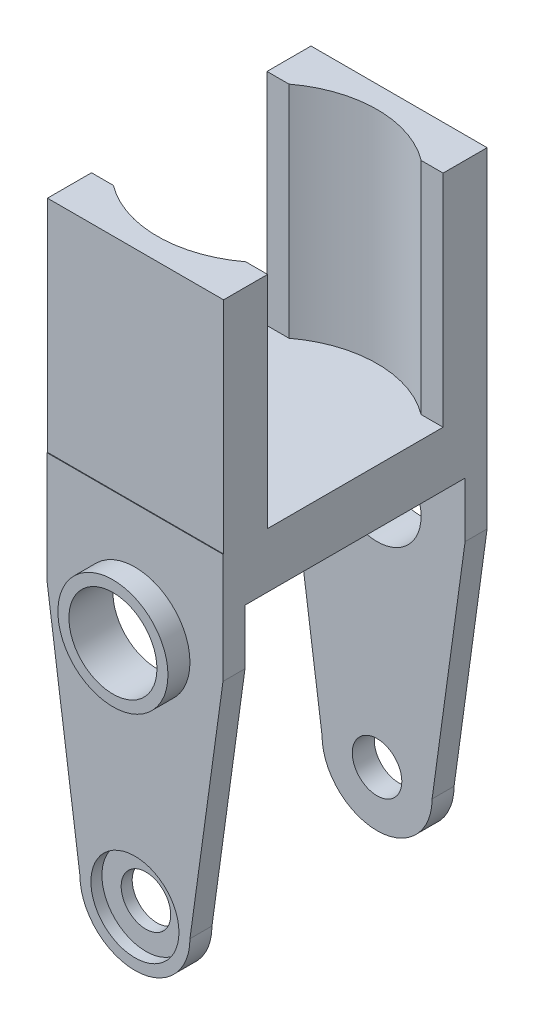
ISO-10303-21;
HEADER;
FILE_DESCRIPTION(('STEP AP214'),'2;1');
FILE_NAME('part.step','',(''),(''),'','','');
FILE_SCHEMA(('AUTOMOTIVE_DESIGN { 1 0 10303 214 1 1 1 1 }'));
ENDSEC;
DATA;
#1=APPLICATION_CONTEXT('core data for automotive mechanical design processes');
#2=APPLICATION_PROTOCOL_DEFINITION('international standard','automotive_design',2000,#1);
#3=PRODUCT_CONTEXT('',#1,'mechanical');
#4=PRODUCT('Part','Part','',(#3));
#5=PRODUCT_RELATED_PRODUCT_CATEGORY('part','',(#4));
#6=PRODUCT_DEFINITION_FORMATION('','',#4);
#7=PRODUCT_DEFINITION_CONTEXT('part definition',#1,'design');
#8=PRODUCT_DEFINITION('design','',#6,#7);
#9=PRODUCT_DEFINITION_SHAPE('','',#8);
#10=(LENGTH_UNIT() NAMED_UNIT(*) SI_UNIT(.MILLI.,.METRE.));
#11=(NAMED_UNIT(*) PLANE_ANGLE_UNIT() SI_UNIT($,.RADIAN.));
#12=(NAMED_UNIT(*) SI_UNIT($,.STERADIAN.) SOLID_ANGLE_UNIT());
#13=UNCERTAINTY_MEASURE_WITH_UNIT(LENGTH_MEASURE(1.E-05),#10,'distance_accuracy_value','');
#14=(GEOMETRIC_REPRESENTATION_CONTEXT(3) GLOBAL_UNCERTAINTY_ASSIGNED_CONTEXT((#13)) GLOBAL_UNIT_ASSIGNED_CONTEXT((#10,
#11,#12)) REPRESENTATION_CONTEXT('',''));
#15=CARTESIAN_POINT('',(0.,0.,0.));
#16=DIRECTION('',(0.,0.,1.));
#17=DIRECTION('',(1.,0.,0.));
#18=AXIS2_PLACEMENT_3D('',#15,#16,#17);
#19=CARTESIAN_POINT('',(-8.,10.,24.));
#20=DIRECTION('',(1.,0.,0.));
#21=DIRECTION('',(0.,0.,-1.));
#22=AXIS2_PLACEMENT_3D('',#19,#20,#21);
#23=PLANE('',#22);
#24=DIRECTION('',(0.,1.,0.));
#25=VECTOR('',#24,1.);
#26=CARTESIAN_POINT('',(-8.,0.,2.));
#27=LINE('',#26,#25);
#28=CARTESIAN_POINT('',(-8.,0.,2.));
#29=VERTEX_POINT('',#28);
#30=CARTESIAN_POINT('',(-8.,5.,2.));
#31=VERTEX_POINT('',#30);
#32=EDGE_CURVE('E203',#29,#31,#27,.T.);
#33=ORIENTED_EDGE('',*,*,#32,.T.);
#34=DIRECTION('',(0.,0.,1.));
#35=VECTOR('',#34,1.);
#36=CARTESIAN_POINT('',(-8.,5.,0.));
#37=LINE('',#36,#35);
#38=CARTESIAN_POINT('',(-8.,5.,22.));
#39=VERTEX_POINT('',#38);
#40=EDGE_CURVE('E187',#31,#39,#37,.T.);
#41=ORIENTED_EDGE('',*,*,#40,.T.);
#42=DIRECTION('',(0.,-1.,0.));
#43=VECTOR('',#42,1.);
#44=CARTESIAN_POINT('',(-8.,0.,22.));
#45=LINE('',#44,#43);
#46=CARTESIAN_POINT('',(-8.,0.,22.));
#47=VERTEX_POINT('',#46);
#48=EDGE_CURVE('E195',#39,#47,#45,.T.);
#49=ORIENTED_EDGE('',*,*,#48,.T.);
#50=DIRECTION('',(0.,0.,-1.));
#51=VECTOR('',#50,1.);
#52=CARTESIAN_POINT('',(-8.,0.,24.));
#53=LINE('',#52,#51);
#54=CARTESIAN_POINT('',(-8.,0.,24.));
#55=VERTEX_POINT('',#54);
#56=EDGE_CURVE('E371',#55,#47,#53,.T.);
#57=ORIENTED_EDGE('',*,*,#56,.F.);
#58=DIRECTION('',(0.,-1.,0.));
#59=VECTOR('',#58,1.);
#60=CARTESIAN_POINT('',(-8.,10.,24.));
#61=LINE('',#60,#59);
#62=CARTESIAN_POINT('',(-8.,10.,24.));
#63=VERTEX_POINT('',#62);
#64=EDGE_CURVE('E389',#63,#55,#61,.T.);
#65=ORIENTED_EDGE('',*,*,#64,.F.);
#66=DIRECTION('',(0.,0.,-1.));
#67=VECTOR('',#66,1.);
#68=CARTESIAN_POINT('',(-8.,10.,24.));
#69=LINE('',#68,#67);
#70=CARTESIAN_POINT('',(-8.,10.,23.9461241638476));
#71=VERTEX_POINT('',#70);
#72=EDGE_CURVE('E426',#63,#71,#69,.T.);
#73=ORIENTED_EDGE('',*,*,#72,.T.);
#74=DIRECTION('',(0.,-1.,0.));
#75=VECTOR('',#74,1.);
#76=CARTESIAN_POINT('',(-8.,30.,23.9461241638476));
#77=LINE('',#76,#75);
#78=CARTESIAN_POINT('',(-8.,30.,23.9461241638476));
#79=VERTEX_POINT('',#78);
#80=EDGE_CURVE('E292',#79,#71,#77,.T.);
#81=ORIENTED_EDGE('',*,*,#80,.F.);
#82=DIRECTION('',(0.,0.,1.));
#83=VECTOR('',#82,1.);
#84=CARTESIAN_POINT('',(-8.,30.,23.9461241638476));
#85=LINE('',#84,#83);
#86=CARTESIAN_POINT('',(-8.,30.,19.9461241638476));
#87=VERTEX_POINT('',#86);
#88=EDGE_CURVE('E256',#87,#79,#85,.T.);
#89=ORIENTED_EDGE('',*,*,#88,.F.);
#90=DIRECTION('',(0.,-1.,0.));
#91=VECTOR('',#90,1.);
#92=CARTESIAN_POINT('',(-8.,30.,19.9461241638476));
#93=LINE('',#92,#91);
#94=CARTESIAN_POINT('',(-8.,10.,19.9461241638476));
#95=VERTEX_POINT('',#94);
#96=EDGE_CURVE('E296',#87,#95,#93,.T.);
#97=ORIENTED_EDGE('',*,*,#96,.T.);
#98=CARTESIAN_POINT('',(-8.,10.,4.));
#99=VERTEX_POINT('',#98);
#100=EDGE_CURVE('E409',#95,#99,#69,.T.);
#101=ORIENTED_EDGE('',*,*,#100,.T.);
#102=DIRECTION('',(0.,-1.,0.));
#103=VECTOR('',#102,1.);
#104=CARTESIAN_POINT('',(-8.,30.,4.));
#105=LINE('',#104,#103);
#106=CARTESIAN_POINT('',(-8.,30.,4.));
#107=VERTEX_POINT('',#106);
#108=EDGE_CURVE('E347',#107,#99,#105,.T.);
#109=ORIENTED_EDGE('',*,*,#108,.F.);
#110=DIRECTION('',(0.,0.,1.));
#111=VECTOR('',#110,1.);
#112=CARTESIAN_POINT('',(-8.,30.,0.));
#113=LINE('',#112,#111);
#114=CARTESIAN_POINT('',(-8.,30.,0.));
#115=VERTEX_POINT('',#114);
#116=EDGE_CURVE('E304',#115,#107,#113,.T.);
#117=ORIENTED_EDGE('',*,*,#116,.F.);
#118=DIRECTION('',(0.,-1.,0.));
#119=VECTOR('',#118,1.);
#120=CARTESIAN_POINT('',(-8.,10.,0.));
#121=LINE('',#120,#119);
#122=CARTESIAN_POINT('',(-8.,0.,0.));
#123=VERTEX_POINT('',#122);
#124=EDGE_CURVE('E388',#115,#123,#121,.T.);
#125=ORIENTED_EDGE('',*,*,#124,.T.);
#126=EDGE_CURVE('E449',#29,#123,#53,.T.);
#127=ORIENTED_EDGE('',*,*,#126,.F.);
#128=EDGE_LOOP('',(#33,#41,#49,#57,#65,#73,#81,#89,#97,#101,#109,#117,#125,#127));
#129=FACE_BOUND('',#128,.T.);
#130=ADVANCED_FACE('F37',(#129),#23,.F.);
#131=CARTESIAN_POINT('',(-8.,0.,24.));
#132=DIRECTION('',(0.990621129243475,0.136637397137031,0.));
#133=DIRECTION('',(-0.136637397137031,0.990621129243475,0.));
#134=AXIS2_PLACEMENT_3D('',#131,#132,#133);
#135=PLANE('',#134);
#136=DIRECTION('',(0.136637397137031,-0.990621129243475,0.));
#137=VECTOR('',#136,1.);
#138=CARTESIAN_POINT('',(-8.,0.,2.));
#139=LINE('',#138,#137);
#140=CARTESIAN_POINT('',(-5.,-21.75,2.));
#141=VERTEX_POINT('',#140);
#142=EDGE_CURVE('E244',#29,#141,#139,.T.);
#143=ORIENTED_EDGE('',*,*,#142,.F.);
#144=ORIENTED_EDGE('',*,*,#126,.T.);
#145=DIRECTION('',(0.136637397137031,-0.990621129243475,0.));
#146=VECTOR('',#145,1.);
#147=CARTESIAN_POINT('',(-8.,0.,0.));
#148=LINE('',#147,#146);
#149=CARTESIAN_POINT('',(-5.,-21.75,0.));
#150=VERTEX_POINT('',#149);
#151=EDGE_CURVE('E412',#123,#150,#148,.T.);
#152=ORIENTED_EDGE('',*,*,#151,.T.);
#153=DIRECTION('',(0.,0.,-1.));
#154=VECTOR('',#153,1.);
#155=CARTESIAN_POINT('',(-5.,-21.75,24.));
#156=LINE('',#155,#154);
#157=EDGE_CURVE('E444',#141,#150,#156,.T.);
#158=ORIENTED_EDGE('',*,*,#157,.F.);
#159=EDGE_LOOP('',(#143,#144,#152,#158));
#160=FACE_BOUND('',#159,.T.);
#161=ADVANCED_FACE('F476',(#160),#135,.F.);
#162=DIRECTION('',(-0.136637397137031,0.990621129243475,0.));
#163=VECTOR('',#162,1.);
#164=CARTESIAN_POINT('',(-8.,0.,22.));
#165=LINE('',#164,#163);
#166=CARTESIAN_POINT('',(-5.,-21.75,22.));
#167=VERTEX_POINT('',#166);
#168=EDGE_CURVE('E198',#167,#47,#165,.T.);
#169=ORIENTED_EDGE('',*,*,#168,.F.);
#170=CARTESIAN_POINT('',(-5.,-21.75,24.));
#171=VERTEX_POINT('',#170);
#172=EDGE_CURVE('E445',#171,#167,#156,.T.);
#173=ORIENTED_EDGE('',*,*,#172,.F.);
#174=DIRECTION('',(0.136637397137031,-0.990621129243475,0.));
#175=VECTOR('',#174,1.);
#176=CARTESIAN_POINT('',(-8.,0.,24.));
#177=LINE('',#176,#175);
#178=EDGE_CURVE('E393',#55,#171,#177,.T.);
#179=ORIENTED_EDGE('',*,*,#178,.F.);
#180=ORIENTED_EDGE('',*,*,#56,.T.);
#181=EDGE_LOOP('',(#169,#173,#179,#180));
#182=FACE_BOUND('',#181,.T.);
#183=ADVANCED_FACE('F553',(#182),#135,.F.);
#184=CARTESIAN_POINT('',(0.,-21.75,24.));
#185=DIRECTION('',(0.,0.,-1.));
#186=DIRECTION('',(-1.,0.,0.));
#187=AXIS2_PLACEMENT_3D('',#184,#185,#186);
#188=CYLINDRICAL_SURFACE('',#187,5.);
#189=CARTESIAN_POINT('',(0.,-21.75,2.));
#190=DIRECTION('',(0.,0.,1.));
#191=DIRECTION('',(1.,0.,0.));
#192=AXIS2_PLACEMENT_3D('',#189,#190,#191);
#193=CIRCLE('',#192,5.);
#194=CARTESIAN_POINT('',(5.,-21.75,2.));
#195=VERTEX_POINT('',#194);
#196=EDGE_CURVE('E241',#141,#195,#193,.T.);
#197=ORIENTED_EDGE('',*,*,#196,.F.);
#198=ORIENTED_EDGE('',*,*,#157,.T.);
#199=CARTESIAN_POINT('',(0.,-21.75,0.));
#200=DIRECTION('',(0.,0.,1.));
#201=DIRECTION('',(1.,0.,0.));
#202=AXIS2_PLACEMENT_3D('',#199,#200,#201);
#203=CIRCLE('',#202,5.);
#204=CARTESIAN_POINT('',(5.,-21.75,0.));
#205=VERTEX_POINT('',#204);
#206=EDGE_CURVE('E416',#150,#205,#203,.T.);
#207=ORIENTED_EDGE('',*,*,#206,.T.);
#208=DIRECTION('',(0.,0.,-1.));
#209=VECTOR('',#208,1.);
#210=CARTESIAN_POINT('',(5.,-21.75,24.));
#211=LINE('',#210,#209);
#212=EDGE_CURVE('E439',#195,#205,#211,.T.);
#213=ORIENTED_EDGE('',*,*,#212,.F.);
#214=EDGE_LOOP('',(#197,#198,#207,#213));
#215=FACE_BOUND('',#214,.T.);
#216=ADVANCED_FACE('F475',(#215),#188,.T.);
#217=CARTESIAN_POINT('',(0.,-21.75,22.));
#218=DIRECTION('',(0.,0.,-1.));
#219=DIRECTION('',(0.,1.,0.));
#220=AXIS2_PLACEMENT_3D('',#217,#218,#219);
#221=CIRCLE('',#220,5.);
#222=CARTESIAN_POINT('',(5.,-21.75,22.));
#223=VERTEX_POINT('',#222);
#224=EDGE_CURVE('E225',#223,#167,#221,.T.);
#225=ORIENTED_EDGE('',*,*,#224,.F.);
#226=CARTESIAN_POINT('',(5.,-21.75,24.));
#227=VERTEX_POINT('',#226);
#228=EDGE_CURVE('E440',#227,#223,#211,.T.);
#229=ORIENTED_EDGE('',*,*,#228,.F.);
#230=CARTESIAN_POINT('',(0.,-21.75,24.));
#231=DIRECTION('',(0.,0.,1.));
#232=DIRECTION('',(1.,0.,0.));
#233=AXIS2_PLACEMENT_3D('',#230,#231,#232);
#234=CIRCLE('',#233,5.);
#235=EDGE_CURVE('E397',#171,#227,#234,.T.);
#236=ORIENTED_EDGE('',*,*,#235,.F.);
#237=ORIENTED_EDGE('',*,*,#172,.T.);
#238=EDGE_LOOP('',(#225,#229,#236,#237));
#239=FACE_BOUND('',#238,.T.);
#240=ADVANCED_FACE('F550',(#239),#188,.T.);
#241=CARTESIAN_POINT('',(8.,0.,24.));
#242=DIRECTION('',(-0.990621129243475,0.136637397137031,0.));
#243=DIRECTION('',(-0.136637397137031,-0.990621129243475,0.));
#244=AXIS2_PLACEMENT_3D('',#241,#242,#243);
#245=PLANE('',#244);
#246=DIRECTION('',(0.136637397137031,0.990621129243475,0.));
#247=VECTOR('',#246,1.);
#248=CARTESIAN_POINT('',(8.,0.,2.));
#249=LINE('',#248,#247);
#250=CARTESIAN_POINT('',(8.,0.,2.));
#251=VERTEX_POINT('',#250);
#252=EDGE_CURVE('E238',#195,#251,#249,.T.);
#253=ORIENTED_EDGE('',*,*,#252,.F.);
#254=ORIENTED_EDGE('',*,*,#212,.T.);
#255=DIRECTION('',(0.136637397137031,0.990621129243475,0.));
#256=VECTOR('',#255,1.);
#257=CARTESIAN_POINT('',(8.,0.,0.));
#258=LINE('',#257,#256);
#259=CARTESIAN_POINT('',(8.,0.,0.));
#260=VERTEX_POINT('',#259);
#261=EDGE_CURVE('E420',#205,#260,#258,.T.);
#262=ORIENTED_EDGE('',*,*,#261,.T.);
#263=DIRECTION('',(0.,0.,-1.));
#264=VECTOR('',#263,1.);
#265=CARTESIAN_POINT('',(8.,0.,24.));
#266=LINE('',#265,#264);
#267=EDGE_CURVE('E434',#251,#260,#266,.T.);
#268=ORIENTED_EDGE('',*,*,#267,.F.);
#269=EDGE_LOOP('',(#253,#254,#262,#268));
#270=FACE_BOUND('',#269,.T.);
#271=ADVANCED_FACE('F498',(#270),#245,.F.);
#272=DIRECTION('',(-0.136637397137031,-0.990621129243475,0.));
#273=VECTOR('',#272,1.);
#274=CARTESIAN_POINT('',(8.,0.,22.));
#275=LINE('',#274,#273);
#276=CARTESIAN_POINT('',(8.,0.,22.));
#277=VERTEX_POINT('',#276);
#278=EDGE_CURVE('E222',#277,#223,#275,.T.);
#279=ORIENTED_EDGE('',*,*,#278,.F.);
#280=CARTESIAN_POINT('',(8.,0.,24.));
#281=VERTEX_POINT('',#280);
#282=EDGE_CURVE('E435',#281,#277,#266,.T.);
#283=ORIENTED_EDGE('',*,*,#282,.F.);
#284=DIRECTION('',(0.136637397137031,0.990621129243475,0.));
#285=VECTOR('',#284,1.);
#286=CARTESIAN_POINT('',(8.,0.,24.));
#287=LINE('',#286,#285);
#288=EDGE_CURVE('E400',#227,#281,#287,.T.);
#289=ORIENTED_EDGE('',*,*,#288,.F.);
#290=ORIENTED_EDGE('',*,*,#228,.T.);
#291=EDGE_LOOP('',(#279,#283,#289,#290));
#292=FACE_BOUND('',#291,.T.);
#293=ADVANCED_FACE('F546',(#292),#245,.F.);
#294=CARTESIAN_POINT('',(8.,0.,24.));
#295=DIRECTION('',(-1.,0.,0.));
#296=DIRECTION('',(0.,0.,1.));
#297=AXIS2_PLACEMENT_3D('',#294,#295,#296);
#298=PLANE('',#297);
#299=DIRECTION('',(0.,1.,0.));
#300=VECTOR('',#299,1.);
#301=CARTESIAN_POINT('',(8.,0.,2.));
#302=LINE('',#301,#300);
#303=CARTESIAN_POINT('',(8.,5.,2.));
#304=VERTEX_POINT('',#303);
#305=EDGE_CURVE('E235',#251,#304,#302,.T.);
#306=ORIENTED_EDGE('',*,*,#305,.F.);
#307=ORIENTED_EDGE('',*,*,#267,.T.);
#308=DIRECTION('',(0.,1.,0.));
#309=VECTOR('',#308,1.);
#310=CARTESIAN_POINT('',(8.,0.,0.));
#311=LINE('',#310,#309);
#312=CARTESIAN_POINT('',(8.,30.,0.));
#313=VERTEX_POINT('',#312);
#314=EDGE_CURVE('E394',#260,#313,#311,.T.);
#315=ORIENTED_EDGE('',*,*,#314,.T.);
#316=DIRECTION('',(0.,0.,-1.));
#317=VECTOR('',#316,1.);
#318=CARTESIAN_POINT('',(8.,30.,0.));
#319=LINE('',#318,#317);
#320=CARTESIAN_POINT('',(8.,30.,4.00000000000001));
#321=VERTEX_POINT('',#320);
#322=EDGE_CURVE('E318',#321,#313,#319,.T.);
#323=ORIENTED_EDGE('',*,*,#322,.F.);
#324=DIRECTION('',(0.,-1.,0.));
#325=VECTOR('',#324,1.);
#326=CARTESIAN_POINT('',(8.,30.,4.00000000000001));
#327=LINE('',#326,#325);
#328=CARTESIAN_POINT('',(8.,10.,4.00000000000001));
#329=VERTEX_POINT('',#328);
#330=EDGE_CURVE('E326',#321,#329,#327,.T.);
#331=ORIENTED_EDGE('',*,*,#330,.T.);
#332=DIRECTION('',(0.,0.,-1.));
#333=VECTOR('',#332,1.);
#334=CARTESIAN_POINT('',(8.,10.,24.));
#335=LINE('',#334,#333);
#336=CARTESIAN_POINT('',(8.,10.,19.9461241638476));
#337=VERTEX_POINT('',#336);
#338=EDGE_CURVE('E430',#337,#329,#335,.T.);
#339=ORIENTED_EDGE('',*,*,#338,.F.);
#340=DIRECTION('',(0.,-1.,0.));
#341=VECTOR('',#340,1.);
#342=CARTESIAN_POINT('',(8.,30.,19.9461241638476));
#343=LINE('',#342,#341);
#344=CARTESIAN_POINT('',(8.,30.,19.9461241638476));
#345=VERTEX_POINT('',#344);
#346=EDGE_CURVE('E284',#345,#337,#343,.T.);
#347=ORIENTED_EDGE('',*,*,#346,.F.);
#348=DIRECTION('',(0.,0.,-1.));
#349=VECTOR('',#348,1.);
#350=CARTESIAN_POINT('',(8.,30.,23.9461241638476));
#351=LINE('',#350,#349);
#352=CARTESIAN_POINT('',(8.,30.,23.9461241638476));
#353=VERTEX_POINT('',#352);
#354=EDGE_CURVE('E262',#353,#345,#351,.T.);
#355=ORIENTED_EDGE('',*,*,#354,.F.);
#356=DIRECTION('',(0.,-1.,0.));
#357=VECTOR('',#356,1.);
#358=CARTESIAN_POINT('',(8.,30.,23.9461241638476));
#359=LINE('',#358,#357);
#360=CARTESIAN_POINT('',(8.,10.,23.9461241638476));
#361=VERTEX_POINT('',#360);
#362=EDGE_CURVE('E288',#353,#361,#359,.T.);
#363=ORIENTED_EDGE('',*,*,#362,.T.);
#364=CARTESIAN_POINT('',(8.,10.,24.));
#365=VERTEX_POINT('',#364);
#366=EDGE_CURVE('E431',#365,#361,#335,.T.);
#367=ORIENTED_EDGE('',*,*,#366,.F.);
#368=DIRECTION('',(0.,1.,0.));
#369=VECTOR('',#368,1.);
#370=CARTESIAN_POINT('',(8.,0.,24.));
#371=LINE('',#370,#369);
#372=EDGE_CURVE('E403',#281,#365,#371,.T.);
#373=ORIENTED_EDGE('',*,*,#372,.F.);
#374=ORIENTED_EDGE('',*,*,#282,.T.);
#375=DIRECTION('',(0.,-1.,0.));
#376=VECTOR('',#375,1.);
#377=CARTESIAN_POINT('',(8.,0.,22.));
#378=LINE('',#377,#376);
#379=CARTESIAN_POINT('',(8.,5.,22.));
#380=VERTEX_POINT('',#379);
#381=EDGE_CURVE('E219',#380,#277,#378,.T.);
#382=ORIENTED_EDGE('',*,*,#381,.F.);
#383=DIRECTION('',(0.,0.,1.));
#384=VECTOR('',#383,1.);
#385=CARTESIAN_POINT('',(8.,5.,24.));
#386=LINE('',#385,#384);
#387=EDGE_CURVE('E11',#304,#380,#386,.T.);
#388=ORIENTED_EDGE('',*,*,#387,.F.);
#389=EDGE_LOOP('',(#306,#307,#315,#323,#331,#339,#347,#355,#363,#367,#373,#374,#382,#388));
#390=FACE_BOUND('',#389,.T.);
#391=ADVANCED_FACE('F494',(#390),#298,.F.);
#392=CARTESIAN_POINT('',(0.,-21.75,24.));
#393=DIRECTION('',(0.,0.,1.));
#394=DIRECTION('',(1.,0.,0.));
#395=AXIS2_PLACEMENT_3D('',#392,#393,#394);
#396=CYLINDRICAL_SURFACE('',#395,2.25);
#397=CARTESIAN_POINT('',(0.,-21.75,0.));
#398=DIRECTION('',(0.,0.,1.));
#399=DIRECTION('',(1.,0.,0.));
#400=AXIS2_PLACEMENT_3D('',#397,#398,#399);
#401=CIRCLE('',#400,2.24999999999999);
#402=CARTESIAN_POINT('',(2.25,-21.75,0.));
#403=VERTEX_POINT('',#402);
#404=EDGE_CURVE('E384',#403,#403,#401,.T.);
#405=ORIENTED_EDGE('',*,*,#404,.F.);
#406=EDGE_LOOP('',(#405));
#407=FACE_BOUND('',#406,.T.);
#408=CARTESIAN_POINT('',(0.,-21.75,2.));
#409=DIRECTION('',(0.,0.,1.));
#410=DIRECTION('',(1.,0.,0.));
#411=AXIS2_PLACEMENT_3D('',#408,#409,#410);
#412=CIRCLE('',#411,2.25);
#413=CARTESIAN_POINT('',(2.25,-21.75,2.));
#414=VERTEX_POINT('',#413);
#415=EDGE_CURVE('E231',#414,#414,#412,.F.);
#416=ORIENTED_EDGE('',*,*,#415,.F.);
#417=EDGE_LOOP('',(#416));
#418=FACE_BOUND('',#417,.T.);
#419=ADVANCED_FACE('F600',(#407,#418),#396,.F.);
#420=CARTESIAN_POINT('',(0.,-21.75,23.));
#421=DIRECTION('',(0.,0.,1.));
#422=DIRECTION('',(1.,0.,0.));
#423=AXIS2_PLACEMENT_3D('',#420,#421,#422);
#424=CIRCLE('',#423,2.25);
#425=CARTESIAN_POINT('',(2.25,-21.75,23.));
#426=VERTEX_POINT('',#425);
#427=EDGE_CURVE('E380',#426,#426,#424,.T.);
#428=ORIENTED_EDGE('',*,*,#427,.T.);
#429=EDGE_LOOP('',(#428));
#430=FACE_BOUND('',#429,.T.);
#431=CARTESIAN_POINT('',(0.,-21.75,22.));
#432=DIRECTION('',(0.,0.,-1.));
#433=DIRECTION('',(0.,1.,0.));
#434=AXIS2_PLACEMENT_3D('',#431,#432,#433);
#435=CIRCLE('',#434,2.25);
#436=CARTESIAN_POINT('',(0.,-19.5,22.));
#437=VERTEX_POINT('',#436);
#438=EDGE_CURVE('E215',#437,#437,#435,.F.);
#439=ORIENTED_EDGE('',*,*,#438,.F.);
#440=EDGE_LOOP('',(#439));
#441=FACE_BOUND('',#440,.T.);
#442=ADVANCED_FACE('F608',(#430,#441),#396,.F.);
#443=CARTESIAN_POINT('',(0.,0.,24.));
#444=DIRECTION('',(0.,0.,-1.));
#445=DIRECTION('',(-1.,0.,0.));
#446=AXIS2_PLACEMENT_3D('',#443,#444,#445);
#447=CYLINDRICAL_SURFACE('',#446,4.);
#448=CARTESIAN_POINT('',(0.,0.,-2.));
#449=DIRECTION('',(0.,0.,1.));
#450=DIRECTION('',(1.,0.,0.));
#451=AXIS2_PLACEMENT_3D('',#448,#449,#450);
#452=CIRCLE('',#451,4.);
#453=CARTESIAN_POINT('',(4.,0.,-2.));
#454=VERTEX_POINT('',#453);
#455=EDGE_CURVE('E359',#454,#454,#452,.T.);
#456=ORIENTED_EDGE('',*,*,#455,.F.);
#457=EDGE_LOOP('',(#456));
#458=FACE_BOUND('',#457,.T.);
#459=CARTESIAN_POINT('',(0.,0.,2.));
#460=DIRECTION('',(0.,0.,1.));
#461=DIRECTION('',(1.,0.,0.));
#462=AXIS2_PLACEMENT_3D('',#459,#460,#461);
#463=CIRCLE('',#462,4.);
#464=CARTESIAN_POINT('',(4.,0.,2.));
#465=VERTEX_POINT('',#464);
#466=EDGE_CURVE('E230',#465,#465,#463,.T.);
#467=ORIENTED_EDGE('',*,*,#466,.T.);
#468=EDGE_LOOP('',(#467));
#469=FACE_BOUND('',#468,.T.);
#470=ADVANCED_FACE('F461',(#458,#469),#447,.F.);
#471=CARTESIAN_POINT('',(0.,0.,26.));
#472=DIRECTION('',(0.,0.,1.));
#473=DIRECTION('',(1.,0.,0.));
#474=AXIS2_PLACEMENT_3D('',#471,#472,#473);
#475=CIRCLE('',#474,4.);
#476=CARTESIAN_POINT('',(4.,0.,26.));
#477=VERTEX_POINT('',#476);
#478=EDGE_CURVE('E351',#477,#477,#475,.T.);
#479=ORIENTED_EDGE('',*,*,#478,.T.);
#480=EDGE_LOOP('',(#479));
#481=FACE_BOUND('',#480,.T.);
#482=CARTESIAN_POINT('',(0.,0.,22.));
#483=DIRECTION('',(0.,0.,-1.));
#484=DIRECTION('',(0.,1.,0.));
#485=AXIS2_PLACEMENT_3D('',#482,#483,#484);
#486=CIRCLE('',#485,4.);
#487=CARTESIAN_POINT('',(0.,4.,22.));
#488=VERTEX_POINT('',#487);
#489=EDGE_CURVE('E213',#488,#488,#486,.T.);
#490=ORIENTED_EDGE('',*,*,#489,.T.);
#491=EDGE_LOOP('',(#490));
#492=FACE_BOUND('',#491,.T.);
#493=ADVANCED_FACE('F624',(#481,#492),#447,.F.);
#494=CARTESIAN_POINT('',(-5.,10.,24.));
#495=DIRECTION('',(0.,-1.,0.));
#496=DIRECTION('',(0.,0.,-1.));
#497=AXIS2_PLACEMENT_3D('',#494,#495,#496);
#498=PLANE('',#497);
#499=DIRECTION('',(1.,0.,0.));
#500=VECTOR('',#499,1.);
#501=CARTESIAN_POINT('',(-8.,10.,23.9461241638476));
#502=LINE('',#501,#500);
#503=EDGE_CURVE('E274',#71,#361,#502,.T.);
#504=ORIENTED_EDGE('',*,*,#503,.F.);
#505=ORIENTED_EDGE('',*,*,#72,.F.);
#506=DIRECTION('',(-1.,0.,0.));
#507=VECTOR('',#506,1.);
#508=CARTESIAN_POINT('',(8.,10.,24.));
#509=LINE('',#508,#507);
#510=EDGE_CURVE('E406',#365,#63,#509,.T.);
#511=ORIENTED_EDGE('',*,*,#510,.F.);
#512=ORIENTED_EDGE('',*,*,#366,.T.);
#513=EDGE_LOOP('',(#504,#505,#511,#512));
#514=FACE_BOUND('',#513,.T.);
#515=ADVANCED_FACE('F537',(#514),#498,.F.);
#516=DIRECTION('',(-1.,0.,0.));
#517=VECTOR('',#516,1.);
#518=CARTESIAN_POINT('',(-8.,10.,19.9461241638476));
#519=LINE('',#518,#517);
#520=CARTESIAN_POINT('',(-6.00897259706722,10.,19.9461241638476));
#521=VERTEX_POINT('',#520);
#522=EDGE_CURVE('E59',#521,#95,#519,.T.);
#523=ORIENTED_EDGE('',*,*,#522,.F.);
#524=CARTESIAN_POINT('',(0.,10.,11.9730620819238));
#525=DIRECTION('',(0.,-1.,0.));
#526=DIRECTION('',(0.,0.,1.));
#527=AXIS2_PLACEMENT_3D('',#524,#525,#526);
#528=CIRCLE('',#527,9.98386050756499);
#529=CARTESIAN_POINT('',(6.00897259706722,10.,19.9461241638476));
#530=VERTEX_POINT('',#529);
#531=EDGE_CURVE('E247',#530,#521,#528,.T.);
#532=ORIENTED_EDGE('',*,*,#531,.F.);
#533=DIRECTION('',(-1.,0.,0.));
#534=VECTOR('',#533,1.);
#535=CARTESIAN_POINT('',(8.,10.,19.9461241638476));
#536=LINE('',#535,#534);
#537=EDGE_CURVE('E253',#337,#530,#536,.T.);
#538=ORIENTED_EDGE('',*,*,#537,.F.);
#539=ORIENTED_EDGE('',*,*,#338,.T.);
#540=DIRECTION('',(1.,0.,0.));
#541=VECTOR('',#540,1.);
#542=CARTESIAN_POINT('',(8.,10.,4.00000000000001));
#543=LINE('',#542,#541);
#544=CARTESIAN_POINT('',(6.00897259706722,10.,4.00000000000001));
#545=VERTEX_POINT('',#544);
#546=EDGE_CURVE('E309',#545,#329,#543,.T.);
#547=ORIENTED_EDGE('',*,*,#546,.F.);
#548=CARTESIAN_POINT('',(0.,10.,11.9730620819238));
#549=DIRECTION('',(0.,-1.,0.));
#550=DIRECTION('',(0.,0.,-1.));
#551=AXIS2_PLACEMENT_3D('',#548,#549,#550);
#552=CIRCLE('',#551,9.98386050756499);
#553=CARTESIAN_POINT('',(-6.00897259706723,10.,4.00000000000001));
#554=VERTEX_POINT('',#553);
#555=EDGE_CURVE('E330',#554,#545,#552,.T.);
#556=ORIENTED_EDGE('',*,*,#555,.F.);
#557=DIRECTION('',(1.,0.,0.));
#558=VECTOR('',#557,1.);
#559=CARTESIAN_POINT('',(-8.,10.,4.));
#560=LINE('',#559,#558);
#561=EDGE_CURVE('E303',#99,#554,#560,.T.);
#562=ORIENTED_EDGE('',*,*,#561,.F.);
#563=ORIENTED_EDGE('',*,*,#100,.F.);
#564=EDGE_LOOP('',(#523,#532,#538,#539,#547,#556,#562,#563));
#565=FACE_BOUND('',#564,.T.);
#566=ADVANCED_FACE('F504',(#565),#498,.F.);
#567=CARTESIAN_POINT('',(0.,-21.75,24.));
#568=DIRECTION('',(0.,0.,1.));
#569=DIRECTION('',(1.,0.,0.));
#570=AXIS2_PLACEMENT_3D('',#567,#568,#569);
#571=PLANE('',#570);
#572=CARTESIAN_POINT('',(0.,0.,24.));
#573=DIRECTION('',(0.,0.,1.));
#574=DIRECTION('',(1.,0.,0.));
#575=AXIS2_PLACEMENT_3D('',#572,#573,#574);
#576=CIRCLE('',#575,5.);
#577=CARTESIAN_POINT('',(5.,0.,24.));
#578=VERTEX_POINT('',#577);
#579=EDGE_CURVE('E45',#578,#578,#576,.T.);
#580=ORIENTED_EDGE('',*,*,#579,.F.);
#581=EDGE_LOOP('',(#580));
#582=FACE_BOUND('',#581,.T.);
#583=CARTESIAN_POINT('',(0.,-21.75,24.));
#584=DIRECTION('',(0.,0.,1.));
#585=DIRECTION('',(1.,0.,0.));
#586=AXIS2_PLACEMENT_3D('',#583,#584,#585);
#587=CIRCLE('',#586,4.);
#588=CARTESIAN_POINT('',(4.,-21.75,24.));
#589=VERTEX_POINT('',#588);
#590=EDGE_CURVE('E372',#589,#589,#587,.T.);
#591=ORIENTED_EDGE('',*,*,#590,.F.);
#592=EDGE_LOOP('',(#591));
#593=FACE_BOUND('',#592,.T.);
#594=ORIENTED_EDGE('',*,*,#64,.T.);
#595=ORIENTED_EDGE('',*,*,#178,.T.);
#596=ORIENTED_EDGE('',*,*,#235,.T.);
#597=ORIENTED_EDGE('',*,*,#288,.T.);
#598=ORIENTED_EDGE('',*,*,#372,.T.);
#599=ORIENTED_EDGE('',*,*,#510,.T.);
#600=EDGE_LOOP('',(#594,#595,#596,#597,#598,#599));
#601=FACE_BOUND('',#600,.T.);
#602=ADVANCED_FACE('F540',(#582,#593,#601),#571,.T.);
#603=CARTESIAN_POINT('',(0.,-21.75,0.));
#604=DIRECTION('',(0.,0.,1.));
#605=DIRECTION('',(1.,0.,0.));
#606=AXIS2_PLACEMENT_3D('',#603,#604,#605);
#607=PLANE('',#606);
#608=CARTESIAN_POINT('',(0.,0.,0.));
#609=DIRECTION('',(0.,0.,1.));
#610=DIRECTION('',(1.,0.,0.));
#611=AXIS2_PLACEMENT_3D('',#608,#609,#610);
#612=CIRCLE('',#611,5.);
#613=CARTESIAN_POINT('',(5.,0.,0.));
#614=VERTEX_POINT('',#613);
#615=EDGE_CURVE('E367',#614,#614,#612,.T.);
#616=ORIENTED_EDGE('',*,*,#615,.T.);
#617=EDGE_LOOP('',(#616));
#618=FACE_BOUND('',#617,.T.);
#619=ORIENTED_EDGE('',*,*,#404,.T.);
#620=EDGE_LOOP('',(#619));
#621=FACE_BOUND('',#620,.T.);
#622=ORIENTED_EDGE('',*,*,#124,.F.);
#623=DIRECTION('',(-1.,0.,0.));
#624=VECTOR('',#623,1.);
#625=CARTESIAN_POINT('',(-8.,30.,0.));
#626=LINE('',#625,#624);
#627=EDGE_CURVE('E322',#313,#115,#626,.T.);
#628=ORIENTED_EDGE('',*,*,#627,.F.);
#629=ORIENTED_EDGE('',*,*,#314,.F.);
#630=ORIENTED_EDGE('',*,*,#261,.F.);
#631=ORIENTED_EDGE('',*,*,#206,.F.);
#632=ORIENTED_EDGE('',*,*,#151,.F.);
#633=EDGE_LOOP('',(#622,#628,#629,#630,#631,#632));
#634=FACE_BOUND('',#633,.T.);
#635=ADVANCED_FACE('F482',(#618,#621,#634),#607,.F.);
#636=CARTESIAN_POINT('',(2.25,-21.75,23.));
#637=DIRECTION('',(0.,0.,-1.));
#638=DIRECTION('',(-1.,0.,0.));
#639=AXIS2_PLACEMENT_3D('',#636,#637,#638);
#640=PLANE('',#639);
#641=ORIENTED_EDGE('',*,*,#427,.F.);
#642=EDGE_LOOP('',(#641));
#643=FACE_BOUND('',#642,.T.);
#644=CARTESIAN_POINT('',(0.,-21.75,23.));
#645=DIRECTION('',(0.,0.,1.));
#646=DIRECTION('',(1.,0.,0.));
#647=AXIS2_PLACEMENT_3D('',#644,#645,#646);
#648=CIRCLE('',#647,4.);
#649=CARTESIAN_POINT('',(4.,-21.75,23.));
#650=VERTEX_POINT('',#649);
#651=EDGE_CURVE('E376',#650,#650,#648,.T.);
#652=ORIENTED_EDGE('',*,*,#651,.T.);
#653=EDGE_LOOP('',(#652));
#654=FACE_BOUND('',#653,.T.);
#655=ADVANCED_FACE('F665',(#643,#654),#640,.F.);
#656=CARTESIAN_POINT('',(0.,-21.75,24.));
#657=DIRECTION('',(0.,0.,1.));
#658=DIRECTION('',(1.,0.,0.));
#659=AXIS2_PLACEMENT_3D('',#656,#657,#658);
#660=CYLINDRICAL_SURFACE('',#659,4.);
#661=ORIENTED_EDGE('',*,*,#651,.F.);
#662=EDGE_LOOP('',(#661));
#663=FACE_BOUND('',#662,.T.);
#664=ORIENTED_EDGE('',*,*,#590,.T.);
#665=EDGE_LOOP('',(#664));
#666=FACE_BOUND('',#665,.T.);
#667=ADVANCED_FACE('F675',(#663,#666),#660,.F.);
#668=CARTESIAN_POINT('',(0.,0.,-2.));
#669=DIRECTION('',(0.,0.,1.));
#670=DIRECTION('',(1.,0.,0.));
#671=AXIS2_PLACEMENT_3D('',#668,#669,#670);
#672=CYLINDRICAL_SURFACE('',#671,5.);
#673=CARTESIAN_POINT('',(0.,0.,-2.));
#674=DIRECTION('',(0.,0.,1.));
#675=DIRECTION('',(1.,0.,0.));
#676=AXIS2_PLACEMENT_3D('',#673,#674,#675);
#677=CIRCLE('',#676,5.);
#678=CARTESIAN_POINT('',(5.,0.,-2.));
#679=VERTEX_POINT('',#678);
#680=EDGE_CURVE('E363',#679,#679,#677,.T.);
#681=CARTESIAN_POINT('',(5.,0.,-2.));
#682=CARTESIAN_POINT('',(5.,0.,-1.97916666666667));
#683=CARTESIAN_POINT('',(5.,0.,-1.95833333333333));
#684=CARTESIAN_POINT('',(5.,0.,-1.91666666666667));
#685=CARTESIAN_POINT('',(5.,0.,-1.89583333333333));
#686=CARTESIAN_POINT('',(5.,0.,-1.85416666666667));
#687=CARTESIAN_POINT('',(5.,0.,-1.83333333333333));
#688=CARTESIAN_POINT('',(5.,0.,-1.79166666666667));
#689=CARTESIAN_POINT('',(5.,0.,-1.77083333333333));
#690=CARTESIAN_POINT('',(5.,0.,-1.72916666666667));
#691=CARTESIAN_POINT('',(5.,0.,-1.70833333333333));
#692=CARTESIAN_POINT('',(5.,0.,-1.66666666666667));
#693=CARTESIAN_POINT('',(5.,0.,-1.64583333333333));
#694=CARTESIAN_POINT('',(5.,0.,-1.60416666666667));
#695=CARTESIAN_POINT('',(5.,0.,-1.58333333333333));
#696=CARTESIAN_POINT('',(5.,0.,-1.54166666666667));
#697=CARTESIAN_POINT('',(5.,0.,-1.52083333333333));
#698=CARTESIAN_POINT('',(5.,0.,-1.47916666666667));
#699=CARTESIAN_POINT('',(5.,0.,-1.45833333333333));
#700=CARTESIAN_POINT('',(5.,0.,-1.41666666666667));
#701=CARTESIAN_POINT('',(5.,0.,-1.39583333333333));
#702=CARTESIAN_POINT('',(5.,0.,-1.35416666666667));
#703=CARTESIAN_POINT('',(5.,0.,-1.33333333333333));
#704=CARTESIAN_POINT('',(5.,0.,-1.29166666666667));
#705=CARTESIAN_POINT('',(5.,0.,-1.27083333333333));
#706=CARTESIAN_POINT('',(5.,0.,-1.22916666666667));
#707=CARTESIAN_POINT('',(5.,0.,-1.20833333333333));
#708=CARTESIAN_POINT('',(5.,0.,-1.16666666666667));
#709=CARTESIAN_POINT('',(5.,0.,-1.14583333333333));
#710=CARTESIAN_POINT('',(5.,0.,-1.10416666666667));
#711=CARTESIAN_POINT('',(5.,0.,-1.08333333333333));
#712=CARTESIAN_POINT('',(5.,0.,-1.04166666666667));
#713=CARTESIAN_POINT('',(5.,0.,-1.02083333333333));
#714=CARTESIAN_POINT('',(5.,0.,-0.979166666666666));
#715=CARTESIAN_POINT('',(5.,0.,-0.958333333333333));
#716=CARTESIAN_POINT('',(5.,0.,-0.916666666666666));
#717=CARTESIAN_POINT('',(5.,0.,-0.895833333333333));
#718=CARTESIAN_POINT('',(5.,0.,-0.854166666666666));
#719=CARTESIAN_POINT('',(5.,0.,-0.833333333333333));
#720=CARTESIAN_POINT('',(5.,0.,-0.791666666666667));
#721=CARTESIAN_POINT('',(5.,0.,-0.770833333333333));
#722=CARTESIAN_POINT('',(5.,0.,-0.729166666666667));
#723=CARTESIAN_POINT('',(5.,0.,-0.708333333333333));
#724=CARTESIAN_POINT('',(5.,0.,-0.666666666666666));
#725=CARTESIAN_POINT('',(5.,0.,-0.645833333333333));
#726=CARTESIAN_POINT('',(5.,0.,-0.604166666666667));
#727=CARTESIAN_POINT('',(5.,0.,-0.583333333333333));
#728=CARTESIAN_POINT('',(5.,0.,-0.541666666666667));
#729=CARTESIAN_POINT('',(5.,0.,-0.520833333333333));
#730=CARTESIAN_POINT('',(5.,0.,-0.479166666666667));
#731=CARTESIAN_POINT('',(5.,0.,-0.458333333333333));
#732=CARTESIAN_POINT('',(5.,0.,-0.416666666666667));
#733=CARTESIAN_POINT('',(5.,0.,-0.395833333333333));
#734=CARTESIAN_POINT('',(5.,0.,-0.354166666666667));
#735=CARTESIAN_POINT('',(5.,0.,-0.333333333333334));
#736=CARTESIAN_POINT('',(5.,0.,-0.291666666666667));
#737=CARTESIAN_POINT('',(5.,0.,-0.270833333333334));
#738=CARTESIAN_POINT('',(5.,0.,-0.229166666666667));
#739=CARTESIAN_POINT('',(5.,0.,-0.208333333333334));
#740=CARTESIAN_POINT('',(5.,0.,-0.166666666666667));
#741=CARTESIAN_POINT('',(5.,0.,-0.145833333333334));
#742=CARTESIAN_POINT('',(5.,0.,-0.104166666666667));
#743=CARTESIAN_POINT('',(5.,0.,-0.0833333333333338));
#744=CARTESIAN_POINT('',(5.,0.,-0.0416666666666671));
#745=CARTESIAN_POINT('',(5.,0.,-0.0208333333333338));
#746=CARTESIAN_POINT('',(5.,0.,0.));
#747=B_SPLINE_CURVE_WITH_KNOTS('',3,(#681,#682,#683,#684,#685,#686,#687,#688,#689,#690,#691,
#692,#693,#694,#695,#696,#697,#698,#699,#700,#701,#702,#703,#704,#705,#706,#707,#708,#709,#710,
#711,#712,#713,#714,#715,#716,#717,#718,#719,#720,#721,#722,#723,#724,#725,#726,#727,#728,#729,
#730,#731,#732,#733,#734,#735,#736,#737,#738,#739,#740,#741,#742,#743,#744,#745,#746),
.UNSPECIFIED.,.F.,.F.,(4,2,2,2,2,2,2,2,2,2,2,2,2,2,2,2,2,2,2,2,2,2,2,2,2,2,2,2,2,2,2,2,4),(0.,
0.0624999999999996,0.125,0.1875,0.25,0.312499999999999,0.374999999999999,0.437499999999999,
0.499999999999999,0.562499999999999,0.624999999999999,0.687499999999999,0.749999999999999,
0.812499999999999,0.874999999999999,0.937499999999999,0.999999999999999,1.0625,1.125,1.1875,
1.25,1.3125,1.375,1.4375,1.5,1.5625,1.625,1.6875,1.75,1.8125,1.875,1.9375,2.),.UNSPECIFIED.);
#748=EDGE_CURVE('BSEAM683',#679,#614,#747,.T.);
#749=ORIENTED_EDGE('',*,*,#680,.T.);
#750=ORIENTED_EDGE('',*,*,#615,.F.);
#751=ORIENTED_EDGE('',*,*,#748,.T.);
#752=ORIENTED_EDGE('',*,*,#748,.F.);
#753=EDGE_LOOP('',(#749,#751,#750,#752));
#754=FACE_BOUND('',#753,.T.);
#755=ADVANCED_FACE('F683',(#754),#672,.T.);
#756=CARTESIAN_POINT('',(0.,0.,-2.));
#757=DIRECTION('',(0.,0.,1.));
#758=DIRECTION('',(1.,0.,0.));
#759=AXIS2_PLACEMENT_3D('',#756,#757,#758);
#760=PLANE('',#759);
#761=ORIENTED_EDGE('',*,*,#455,.T.);
#762=EDGE_LOOP('',(#761));
#763=FACE_BOUND('',#762,.T.);
#764=ORIENTED_EDGE('',*,*,#680,.F.);
#765=EDGE_LOOP('',(#764));
#766=FACE_BOUND('',#765,.T.);
#767=ADVANCED_FACE('F691',(#763,#766),#760,.F.);
#768=CARTESIAN_POINT('',(0.,0.,26.));
#769=DIRECTION('',(0.,0.,1.));
#770=DIRECTION('',(1.,0.,0.));
#771=AXIS2_PLACEMENT_3D('',#768,#769,#770);
#772=CIRCLE('',#771,5.);
#773=CARTESIAN_POINT('',(5.,0.,26.));
#774=VERTEX_POINT('',#773);
#775=EDGE_CURVE('E355',#774,#774,#772,.T.);
#776=CARTESIAN_POINT('',(5.,0.,24.));
#777=CARTESIAN_POINT('',(5.,0.,24.0208333333333));
#778=CARTESIAN_POINT('',(5.,0.,24.0416666666667));
#779=CARTESIAN_POINT('',(5.,0.,24.0833333333333));
#780=CARTESIAN_POINT('',(5.,0.,24.1041666666667));
#781=CARTESIAN_POINT('',(5.,0.,24.1458333333333));
#782=CARTESIAN_POINT('',(5.,0.,24.1666666666667));
#783=CARTESIAN_POINT('',(5.,0.,24.2083333333333));
#784=CARTESIAN_POINT('',(5.,0.,24.2291666666667));
#785=CARTESIAN_POINT('',(5.,0.,24.2708333333333));
#786=CARTESIAN_POINT('',(5.,0.,24.2916666666667));
#787=CARTESIAN_POINT('',(5.,0.,24.3333333333333));
#788=CARTESIAN_POINT('',(5.,0.,24.3541666666667));
#789=CARTESIAN_POINT('',(5.,0.,24.3958333333333));
#790=CARTESIAN_POINT('',(5.,0.,24.4166666666667));
#791=CARTESIAN_POINT('',(5.,0.,24.4583333333333));
#792=CARTESIAN_POINT('',(5.,0.,24.4791666666667));
#793=CARTESIAN_POINT('',(5.,0.,24.5208333333333));
#794=CARTESIAN_POINT('',(5.,0.,24.5416666666667));
#795=CARTESIAN_POINT('',(5.,0.,24.5833333333333));
#796=CARTESIAN_POINT('',(5.,0.,24.6041666666667));
#797=CARTESIAN_POINT('',(5.,0.,24.6458333333333));
#798=CARTESIAN_POINT('',(5.,0.,24.6666666666667));
#799=CARTESIAN_POINT('',(5.,0.,24.7083333333333));
#800=CARTESIAN_POINT('',(5.,0.,24.7291666666667));
#801=CARTESIAN_POINT('',(5.,0.,24.7708333333333));
#802=CARTESIAN_POINT('',(5.,0.,24.7916666666667));
#803=CARTESIAN_POINT('',(5.,0.,24.8333333333333));
#804=CARTESIAN_POINT('',(5.,0.,24.8541666666667));
#805=CARTESIAN_POINT('',(5.,0.,24.8958333333333));
#806=CARTESIAN_POINT('',(5.,0.,24.9166666666667));
#807=CARTESIAN_POINT('',(5.,0.,24.9583333333333));
#808=CARTESIAN_POINT('',(5.,0.,24.9791666666667));
#809=CARTESIAN_POINT('',(5.,0.,25.0208333333333));
#810=CARTESIAN_POINT('',(5.,0.,25.0416666666667));
#811=CARTESIAN_POINT('',(5.,0.,25.0833333333333));
#812=CARTESIAN_POINT('',(5.,0.,25.1041666666667));
#813=CARTESIAN_POINT('',(5.,0.,25.1458333333333));
#814=CARTESIAN_POINT('',(5.,0.,25.1666666666667));
#815=CARTESIAN_POINT('',(5.,0.,25.2083333333333));
#816=CARTESIAN_POINT('',(5.,0.,25.2291666666667));
#817=CARTESIAN_POINT('',(5.,0.,25.2708333333333));
#818=CARTESIAN_POINT('',(5.,0.,25.2916666666667));
#819=CARTESIAN_POINT('',(5.,0.,25.3333333333333));
#820=CARTESIAN_POINT('',(5.,0.,25.3541666666667));
#821=CARTESIAN_POINT('',(5.,0.,25.3958333333333));
#822=CARTESIAN_POINT('',(5.,0.,25.4166666666667));
#823=CARTESIAN_POINT('',(5.,0.,25.4583333333333));
#824=CARTESIAN_POINT('',(5.,0.,25.4791666666667));
#825=CARTESIAN_POINT('',(5.,0.,25.5208333333333));
#826=CARTESIAN_POINT('',(5.,0.,25.5416666666667));
#827=CARTESIAN_POINT('',(5.,0.,25.5833333333333));
#828=CARTESIAN_POINT('',(5.,0.,25.6041666666667));
#829=CARTESIAN_POINT('',(5.,0.,25.6458333333333));
#830=CARTESIAN_POINT('',(5.,0.,25.6666666666667));
#831=CARTESIAN_POINT('',(5.,0.,25.7083333333333));
#832=CARTESIAN_POINT('',(5.,0.,25.7291666666667));
#833=CARTESIAN_POINT('',(5.,0.,25.7708333333333));
#834=CARTESIAN_POINT('',(5.,0.,25.7916666666667));
#835=CARTESIAN_POINT('',(5.,0.,25.8333333333333));
#836=CARTESIAN_POINT('',(5.,0.,25.8541666666667));
#837=CARTESIAN_POINT('',(5.,0.,25.8958333333333));
#838=CARTESIAN_POINT('',(5.,0.,25.9166666666667));
#839=CARTESIAN_POINT('',(5.,0.,25.9583333333333));
#840=CARTESIAN_POINT('',(5.,0.,25.9791666666667));
#841=CARTESIAN_POINT('',(5.,0.,26.));
#842=B_SPLINE_CURVE_WITH_KNOTS('',3,(#776,#777,#778,#779,#780,#781,#782,#783,#784,#785,#786,
#787,#788,#789,#790,#791,#792,#793,#794,#795,#796,#797,#798,#799,#800,#801,#802,#803,#804,#805,
#806,#807,#808,#809,#810,#811,#812,#813,#814,#815,#816,#817,#818,#819,#820,#821,#822,#823,#824,
#825,#826,#827,#828,#829,#830,#831,#832,#833,#834,#835,#836,#837,#838,#839,#840,#841),
.UNSPECIFIED.,.F.,.F.,(4,2,2,2,2,2,2,2,2,2,2,2,2,2,2,2,2,2,2,2,2,2,2,2,2,2,2,2,2,2,2,2,4),(0.,
0.0625000000000001,0.125,0.1875,0.25,0.3125,0.375,0.4375,0.5,0.5625,0.625000000000001,
0.687500000000001,0.750000000000001,0.812500000000001,0.875000000000001,0.937500000000001,1.,
1.0625,1.125,1.1875,1.25,1.3125,1.375,1.4375,1.5,1.5625,1.625,1.6875,1.75,1.8125,1.875,1.9375,
2.),.UNSPECIFIED.);
#843=EDGE_CURVE('BSEAM694',#578,#774,#842,.T.);
#844=ORIENTED_EDGE('',*,*,#579,.T.);
#845=ORIENTED_EDGE('',*,*,#775,.F.);
#846=ORIENTED_EDGE('',*,*,#843,.T.);
#847=ORIENTED_EDGE('',*,*,#843,.F.);
#848=EDGE_LOOP('',(#844,#846,#845,#847));
#849=FACE_BOUND('',#848,.T.);
#850=ADVANCED_FACE('F694',(#849),#672,.T.);
#851=CARTESIAN_POINT('',(0.,0.,26.));
#852=DIRECTION('',(0.,0.,1.));
#853=DIRECTION('',(1.,0.,0.));
#854=AXIS2_PLACEMENT_3D('',#851,#852,#853);
#855=PLANE('',#854);
#856=ORIENTED_EDGE('',*,*,#775,.T.);
#857=EDGE_LOOP('',(#856));
#858=FACE_BOUND('',#857,.T.);
#859=ORIENTED_EDGE('',*,*,#478,.F.);
#860=EDGE_LOOP('',(#859));
#861=FACE_BOUND('',#860,.T.);
#862=ADVANCED_FACE('F709',(#858,#861),#855,.T.);
#863=CARTESIAN_POINT('',(-8.,30.,4.));
#864=DIRECTION('',(0.,0.,-1.));
#865=DIRECTION('',(-1.,0.,0.));
#866=AXIS2_PLACEMENT_3D('',#863,#864,#865);
#867=PLANE('',#866);
#868=ORIENTED_EDGE('',*,*,#561,.T.);
#869=DIRECTION('',(0.,-1.,0.));
#870=VECTOR('',#869,1.);
#871=CARTESIAN_POINT('',(-6.00897259706723,30.,4.00000000000001));
#872=LINE('',#871,#870);
#873=CARTESIAN_POINT('',(-6.00897259706723,30.,4.00000000000001));
#874=VERTEX_POINT('',#873);
#875=EDGE_CURVE('E343',#874,#554,#872,.T.);
#876=ORIENTED_EDGE('',*,*,#875,.F.);
#877=DIRECTION('',(1.,0.,0.));
#878=VECTOR('',#877,1.);
#879=CARTESIAN_POINT('',(-8.,30.,4.));
#880=LINE('',#879,#878);
#881=EDGE_CURVE('E308',#107,#874,#880,.T.);
#882=ORIENTED_EDGE('',*,*,#881,.F.);
#883=ORIENTED_EDGE('',*,*,#108,.T.);
#884=EDGE_LOOP('',(#868,#876,#882,#883));
#885=FACE_BOUND('',#884,.T.);
#886=ADVANCED_FACE('F506',(#885),#867,.F.);
#887=CARTESIAN_POINT('',(0.,30.,11.9730620819238));
#888=DIRECTION('',(0.,-1.,0.));
#889=DIRECTION('',(0.,0.,-1.));
#890=AXIS2_PLACEMENT_3D('',#887,#888,#889);
#891=CYLINDRICAL_SURFACE('',#890,9.98386050756499);
#892=ORIENTED_EDGE('',*,*,#555,.T.);
#893=DIRECTION('',(0.,-1.,0.));
#894=VECTOR('',#893,1.);
#895=CARTESIAN_POINT('',(6.00897259706722,30.,4.00000000000001));
#896=LINE('',#895,#894);
#897=CARTESIAN_POINT('',(6.00897259706722,30.,4.00000000000001));
#898=VERTEX_POINT('',#897);
#899=EDGE_CURVE('E340',#898,#545,#896,.T.);
#900=ORIENTED_EDGE('',*,*,#899,.F.);
#901=CARTESIAN_POINT('',(0.,30.,11.9730620819238));
#902=DIRECTION('',(0.,-1.,0.));
#903=DIRECTION('',(0.,0.,-1.));
#904=AXIS2_PLACEMENT_3D('',#901,#902,#903);
#905=CIRCLE('',#904,9.98386050756499);
#906=EDGE_CURVE('E312',#874,#898,#905,.T.);
#907=ORIENTED_EDGE('',*,*,#906,.F.);
#908=ORIENTED_EDGE('',*,*,#875,.T.);
#909=EDGE_LOOP('',(#892,#900,#907,#908));
#910=FACE_BOUND('',#909,.T.);
#911=ADVANCED_FACE('F510',(#910),#891,.F.);
#912=CARTESIAN_POINT('',(8.,30.,4.00000000000001));
#913=DIRECTION('',(0.,0.,-1.));
#914=DIRECTION('',(-1.,0.,0.));
#915=AXIS2_PLACEMENT_3D('',#912,#913,#914);
#916=PLANE('',#915);
#917=ORIENTED_EDGE('',*,*,#546,.T.);
#918=ORIENTED_EDGE('',*,*,#330,.F.);
#919=DIRECTION('',(1.,0.,0.));
#920=VECTOR('',#919,1.);
#921=CARTESIAN_POINT('',(8.,30.,4.00000000000001));
#922=LINE('',#921,#920);
#923=EDGE_CURVE('E315',#898,#321,#922,.T.);
#924=ORIENTED_EDGE('',*,*,#923,.F.);
#925=ORIENTED_EDGE('',*,*,#899,.T.);
#926=EDGE_LOOP('',(#917,#918,#924,#925));
#927=FACE_BOUND('',#926,.T.);
#928=ADVANCED_FACE('F514',(#927),#916,.F.);
#929=CARTESIAN_POINT('',(0.,30.,11.9730620819238));
#930=DIRECTION('',(0.,-1.,0.));
#931=DIRECTION('',(0.,0.,-1.));
#932=AXIS2_PLACEMENT_3D('',#929,#930,#931);
#933=PLANE('',#932);
#934=ORIENTED_EDGE('',*,*,#116,.T.);
#935=ORIENTED_EDGE('',*,*,#881,.T.);
#936=ORIENTED_EDGE('',*,*,#906,.T.);
#937=ORIENTED_EDGE('',*,*,#923,.T.);
#938=ORIENTED_EDGE('',*,*,#322,.T.);
#939=ORIENTED_EDGE('',*,*,#627,.T.);
#940=EDGE_LOOP('',(#934,#935,#936,#937,#938,#939));
#941=FACE_BOUND('',#940,.T.);
#942=ADVANCED_FACE('F488',(#941),#933,.F.);
#943=CARTESIAN_POINT('',(0.,30.,11.9730620819238));
#944=DIRECTION('',(0.,-1.,0.));
#945=DIRECTION('',(0.,0.,-1.));
#946=AXIS2_PLACEMENT_3D('',#943,#944,#945);
#947=CYLINDRICAL_SURFACE('',#946,9.98386050756499);
#948=ORIENTED_EDGE('',*,*,#531,.T.);
#949=DIRECTION('',(0.,-1.,0.));
#950=VECTOR('',#949,1.);
#951=CARTESIAN_POINT('',(-6.00897259706722,30.,19.9461241638476));
#952=LINE('',#951,#950);
#953=CARTESIAN_POINT('',(-6.00897259706722,30.,19.9461241638476));
#954=VERTEX_POINT('',#953);
#955=EDGE_CURVE('E300',#954,#521,#952,.T.);
#956=ORIENTED_EDGE('',*,*,#955,.F.);
#957=CARTESIAN_POINT('',(0.,30.,11.9730620819238));
#958=DIRECTION('',(0.,-1.,0.));
#959=DIRECTION('',(0.,0.,1.));
#960=AXIS2_PLACEMENT_3D('',#957,#958,#959);
#961=CIRCLE('',#960,9.98386050756499);
#962=CARTESIAN_POINT('',(6.00897259706722,30.,19.9461241638476));
#963=VERTEX_POINT('',#962);
#964=EDGE_CURVE('E248',#963,#954,#961,.T.);
#965=ORIENTED_EDGE('',*,*,#964,.F.);
#966=DIRECTION('',(0.,-1.,0.));
#967=VECTOR('',#966,1.);
#968=CARTESIAN_POINT('',(6.00897259706722,30.,19.9461241638476));
#969=LINE('',#968,#967);
#970=EDGE_CURVE('E268',#963,#530,#969,.T.);
#971=ORIENTED_EDGE('',*,*,#970,.T.);
#972=EDGE_LOOP('',(#948,#956,#965,#971));
#973=FACE_BOUND('',#972,.T.);
#974=ADVANCED_FACE('F744',(#973),#947,.F.);
#975=CARTESIAN_POINT('',(-8.,30.,19.9461241638476));
#976=DIRECTION('',(0.,0.,1.));
#977=DIRECTION('',(1.,0.,0.));
#978=AXIS2_PLACEMENT_3D('',#975,#976,#977);
#979=PLANE('',#978);
#980=ORIENTED_EDGE('',*,*,#522,.T.);
#981=ORIENTED_EDGE('',*,*,#96,.F.);
#982=DIRECTION('',(-1.,0.,0.));
#983=VECTOR('',#982,1.);
#984=CARTESIAN_POINT('',(-8.,30.,19.9461241638476));
#985=LINE('',#984,#983);
#986=EDGE_CURVE('E252',#954,#87,#985,.T.);
#987=ORIENTED_EDGE('',*,*,#986,.F.);
#988=ORIENTED_EDGE('',*,*,#955,.T.);
#989=EDGE_LOOP('',(#980,#981,#987,#988));
#990=FACE_BOUND('',#989,.T.);
#991=ADVANCED_FACE('F752',(#990),#979,.F.);
#992=CARTESIAN_POINT('',(-8.,30.,23.9461241638476));
#993=DIRECTION('',(0.,0.,-1.));
#994=DIRECTION('',(-1.,0.,0.));
#995=AXIS2_PLACEMENT_3D('',#992,#993,#994);
#996=PLANE('',#995);
#997=ORIENTED_EDGE('',*,*,#503,.T.);
#998=ORIENTED_EDGE('',*,*,#362,.F.);
#999=DIRECTION('',(1.,0.,0.));
#1000=VECTOR('',#999,1.);
#1001=CARTESIAN_POINT('',(-8.,30.,23.9461241638476));
#1002=LINE('',#1001,#1000);
#1003=EDGE_CURVE('E259',#79,#353,#1002,.T.);
#1004=ORIENTED_EDGE('',*,*,#1003,.F.);
#1005=ORIENTED_EDGE('',*,*,#80,.T.);
#1006=EDGE_LOOP('',(#997,#998,#1004,#1005));
#1007=FACE_BOUND('',#1006,.T.);
#1008=ADVANCED_FACE('F533',(#1007),#996,.F.);
#1009=CARTESIAN_POINT('',(8.,30.,19.9461241638476));
#1010=DIRECTION('',(0.,0.,1.));
#1011=DIRECTION('',(1.,0.,0.));
#1012=AXIS2_PLACEMENT_3D('',#1009,#1010,#1011);
#1013=PLANE('',#1012);
#1014=ORIENTED_EDGE('',*,*,#537,.T.);
#1015=ORIENTED_EDGE('',*,*,#970,.F.);
#1016=DIRECTION('',(-1.,0.,0.));
#1017=VECTOR('',#1016,1.);
#1018=CARTESIAN_POINT('',(8.,30.,19.9461241638476));
#1019=LINE('',#1018,#1017);
#1020=EDGE_CURVE('E265',#345,#963,#1019,.T.);
#1021=ORIENTED_EDGE('',*,*,#1020,.F.);
#1022=ORIENTED_EDGE('',*,*,#346,.T.);
#1023=EDGE_LOOP('',(#1014,#1015,#1021,#1022));
#1024=FACE_BOUND('',#1023,.T.);
#1025=ADVANCED_FACE('F522',(#1024),#1013,.F.);
#1026=CARTESIAN_POINT('',(0.,30.,11.9730620819238));
#1027=DIRECTION('',(0.,1.,0.));
#1028=DIRECTION('',(0.,0.,1.));
#1029=AXIS2_PLACEMENT_3D('',#1026,#1027,#1028);
#1030=PLANE('',#1029);
#1031=ORIENTED_EDGE('',*,*,#964,.T.);
#1032=ORIENTED_EDGE('',*,*,#986,.T.);
#1033=ORIENTED_EDGE('',*,*,#88,.T.);
#1034=ORIENTED_EDGE('',*,*,#1003,.T.);
#1035=ORIENTED_EDGE('',*,*,#354,.T.);
#1036=ORIENTED_EDGE('',*,*,#1020,.T.);
#1037=EDGE_LOOP('',(#1031,#1032,#1033,#1034,#1035,#1036));
#1038=FACE_BOUND('',#1037,.T.);
#1039=ADVANCED_FACE('F525',(#1038),#1030,.T.);
#1040=CARTESIAN_POINT('',(12.,5.,0.));
#1041=DIRECTION('',(0.,-1.,0.));
#1042=DIRECTION('',(0.,0.,-1.));
#1043=AXIS2_PLACEMENT_3D('',#1040,#1041,#1042);
#1044=PLANE('',#1043);
#1045=ORIENTED_EDGE('',*,*,#387,.T.);
#1046=DIRECTION('',(-1.,0.,0.));
#1047=VECTOR('',#1046,1.);
#1048=CARTESIAN_POINT('',(12.,5.,22.));
#1049=LINE('',#1048,#1047);
#1050=EDGE_CURVE('E52',#380,#39,#1049,.T.);
#1051=ORIENTED_EDGE('',*,*,#1050,.T.);
#1052=ORIENTED_EDGE('',*,*,#40,.F.);
#1053=DIRECTION('',(-1.,0.,0.));
#1054=VECTOR('',#1053,1.);
#1055=CARTESIAN_POINT('',(12.,5.,2.));
#1056=LINE('',#1055,#1054);
#1057=EDGE_CURVE('E192',#304,#31,#1056,.T.);
#1058=ORIENTED_EDGE('',*,*,#1057,.F.);
#1059=EDGE_LOOP('',(#1045,#1051,#1052,#1058));
#1060=FACE_BOUND('',#1059,.T.);
#1061=ADVANCED_FACE('F184',(#1060),#1044,.T.);
#1062=CARTESIAN_POINT('',(12.,0.,2.));
#1063=DIRECTION('',(0.,0.,1.));
#1064=DIRECTION('',(1.,0.,0.));
#1065=AXIS2_PLACEMENT_3D('',#1062,#1063,#1064);
#1066=PLANE('',#1065);
#1067=ORIENTED_EDGE('',*,*,#415,.T.);
#1068=EDGE_LOOP('',(#1067));
#1069=FACE_BOUND('',#1068,.T.);
#1070=ORIENTED_EDGE('',*,*,#466,.F.);
#1071=EDGE_LOOP('',(#1070));
#1072=FACE_BOUND('',#1071,.T.);
#1073=ORIENTED_EDGE('',*,*,#142,.T.);
#1074=ORIENTED_EDGE('',*,*,#196,.T.);
#1075=ORIENTED_EDGE('',*,*,#252,.T.);
#1076=ORIENTED_EDGE('',*,*,#305,.T.);
#1077=ORIENTED_EDGE('',*,*,#1057,.T.);
#1078=ORIENTED_EDGE('',*,*,#32,.F.);
#1079=EDGE_LOOP('',(#1073,#1074,#1075,#1076,#1077,#1078));
#1080=FACE_BOUND('',#1079,.T.);
#1081=ADVANCED_FACE('F463',(#1069,#1072,#1080),#1066,.T.);
#1082=CARTESIAN_POINT('',(12.,0.,22.));
#1083=DIRECTION('',(0.,0.,-1.));
#1084=DIRECTION('',(0.,1.,0.));
#1085=AXIS2_PLACEMENT_3D('',#1082,#1083,#1084);
#1086=PLANE('',#1085);
#1087=ORIENTED_EDGE('',*,*,#438,.T.);
#1088=EDGE_LOOP('',(#1087));
#1089=FACE_BOUND('',#1088,.T.);
#1090=ORIENTED_EDGE('',*,*,#489,.F.);
#1091=EDGE_LOOP('',(#1090));
#1092=FACE_BOUND('',#1091,.T.);
#1093=ORIENTED_EDGE('',*,*,#168,.T.);
#1094=ORIENTED_EDGE('',*,*,#48,.F.);
#1095=ORIENTED_EDGE('',*,*,#1050,.F.);
#1096=ORIENTED_EDGE('',*,*,#381,.T.);
#1097=ORIENTED_EDGE('',*,*,#278,.T.);
#1098=ORIENTED_EDGE('',*,*,#224,.T.);
#1099=EDGE_LOOP('',(#1093,#1094,#1095,#1096,#1097,#1098));
#1100=FACE_BOUND('',#1099,.T.);
#1101=ADVANCED_FACE('F196',(#1089,#1092,#1100),#1086,.T.);
#1102=CLOSED_SHELL('',(#130,#161,#183,#216,#240,#271,#293,#391,#419,#442,#470,#493,#515,#566,
#602,#635,#655,#667,#755,#767,#850,#862,#886,#911,#928,#942,#974,#991,#1008,#1025,#1039,#1061,
#1081,#1101));
#1103=MANIFOLD_SOLID_BREP('B2',#1102);
#1104=ADVANCED_BREP_SHAPE_REPRESENTATION('',(#18,#1103),#14);
#1105=SHAPE_DEFINITION_REPRESENTATION(#9,#1104);
ENDSEC;
END-ISO-10303-21;
